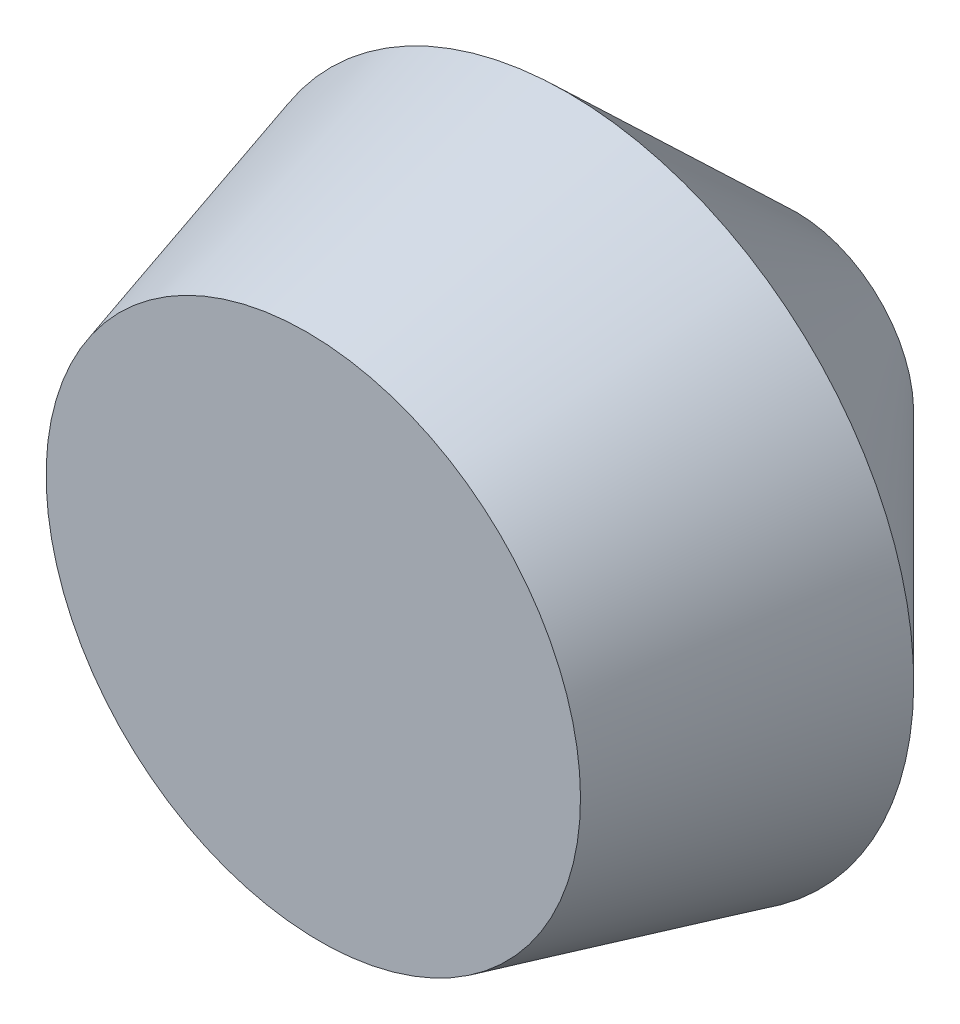
ISO-10303-21;
HEADER;
FILE_DESCRIPTION(('STEP AP214'),'2;1');
FILE_NAME('part.step','',(''),(''),'','','');
FILE_SCHEMA(('AUTOMOTIVE_DESIGN { 1 0 10303 214 1 1 1 1 }'));
ENDSEC;
DATA;
#1=APPLICATION_CONTEXT('core data for automotive mechanical design processes');
#2=APPLICATION_PROTOCOL_DEFINITION('international standard','automotive_design',2000,#1);
#3=PRODUCT_CONTEXT('',#1,'mechanical');
#4=PRODUCT('Part','Part','',(#3));
#5=PRODUCT_RELATED_PRODUCT_CATEGORY('part','',(#4));
#6=PRODUCT_DEFINITION_FORMATION('','',#4);
#7=PRODUCT_DEFINITION_CONTEXT('part definition',#1,'design');
#8=PRODUCT_DEFINITION('design','',#6,#7);
#9=PRODUCT_DEFINITION_SHAPE('','',#8);
#10=(LENGTH_UNIT() NAMED_UNIT(*) SI_UNIT(.MILLI.,.METRE.));
#11=(NAMED_UNIT(*) PLANE_ANGLE_UNIT() SI_UNIT($,.RADIAN.));
#12=(NAMED_UNIT(*) SI_UNIT($,.STERADIAN.) SOLID_ANGLE_UNIT());
#13=UNCERTAINTY_MEASURE_WITH_UNIT(LENGTH_MEASURE(1.E-05),#10,'distance_accuracy_value','');
#14=(GEOMETRIC_REPRESENTATION_CONTEXT(3) GLOBAL_UNCERTAINTY_ASSIGNED_CONTEXT((#13)) GLOBAL_UNIT_ASSIGNED_CONTEXT((#10,
#11,#12)) REPRESENTATION_CONTEXT('',''));
#15=CARTESIAN_POINT('',(0.,0.,0.));
#16=DIRECTION('',(0.,0.,1.));
#17=DIRECTION('',(1.,0.,0.));
#18=AXIS2_PLACEMENT_3D('',#15,#16,#17);
#19=CARTESIAN_POINT('',(-2.3456440540768,62.6400053791689,30.8292296319032));
#20=DIRECTION('',(0.,0.0240493397263667,-0.999710772803177));
#21=DIRECTION('',(0.,0.999710772803177,0.0240493397263667));
#22=AXIS2_PLACEMENT_3D('',#19,#20,#21);
#23=PLANE('',#22);
#24=CARTESIAN_POINT('',(0.0584199999998449,62.4325924386031,30.8242400445075));
#25=DIRECTION('',(0.,-0.0240493397263674,0.999710772803177));
#26=DIRECTION('',(0.,-0.999710772803177,-0.0240493397263674));
#27=AXIS2_PLACEMENT_3D('',#24,#25,#26);
#28=CIRCLE('',#27,2.413);
#29=CARTESIAN_POINT('',(0.0584199999998449,60.020290343829,30.7662089877478));
#30=VERTEX_POINT('',#29);
#31=EDGE_CURVE('E17',#30,#30,#28,.T.);
#32=ORIENTED_EDGE('',*,*,#31,.F.);
#33=EDGE_LOOP('',(#32));
#34=FACE_BOUND('',#33,.T.);
#35=ADVANCED_FACE('F14',(#34),#23,.T.);
#36=CARTESIAN_POINT('',(0.0584199999998508,62.3189737379998,35.5472736195388));
#37=DIRECTION('',(0.,-0.0240493397263674,0.999710772803177));
#38=DIRECTION('',(0.,-0.999710772803177,-0.0240493397263674));
#39=AXIS2_PLACEMENT_3D('',#36,#37,#38);
#40=CONICAL_SURFACE('',#39,7.1374,0.785398163397451);
#41=CARTESIAN_POINT('',(0.0584199999998507,62.3189737379996,35.5472736195492));
#42=DIRECTION('',(0.,0.0240493397263667,-0.999710772803177));
#43=DIRECTION('',(-0.0859813292105588,-0.996008592361908,-0.0239602789724139));
#44=AXIS2_PLACEMENT_3D('',#41,#42,#43);
#45=CIRCLE('',#44,7.13739999997541);
#46=CARTESIAN_POINT('',(-0.555263139105477,55.2100620109002,35.376259524412));
#47=VERTEX_POINT('',#46);
#48=EDGE_CURVE('E21',#47,#47,#45,.F.);
#49=ORIENTED_EDGE('',*,*,#48,.F.);
#50=EDGE_LOOP('',(#49));
#51=FACE_BOUND('',#50,.T.);
#52=ORIENTED_EDGE('',*,*,#31,.T.);
#53=EDGE_LOOP('',(#52));
#54=FACE_BOUND('',#53,.T.);
#55=ADVANCED_FACE('F31',(#51,#54),#40,.T.);
#56=CARTESIAN_POINT('',(0.0584199999998571,62.185807734067,41.0828721107046));
#57=DIRECTION('',(0.,-0.0240493397263667,0.999710772803177));
#58=DIRECTION('',(0.,-0.999710772803177,-0.0240493397263667));
#59=AXIS2_PLACEMENT_3D('',#56,#57,#58);
#60=PLANE('',#59);
#61=CARTESIAN_POINT('',(0.058419999999854,62.1858077340676,41.0828721106782));
#62=DIRECTION('',(0.,0.024049339726367,-0.999710772803177));
#63=DIRECTION('',(0.,0.999710772803177,0.024049339726367));
#64=AXIS2_PLACEMENT_3D('',#61,#62,#63);
#65=CIRCLE('',#64,5.63879999998664);
#66=CARTESIAN_POINT('',(0.058419999999854,67.8229768397368,41.2184815275269));
#67=VERTEX_POINT('',#66);
#68=EDGE_CURVE('E9',#67,#67,#65,.T.);
#69=ORIENTED_EDGE('',*,*,#68,.F.);
#70=EDGE_LOOP('',(#69));
#71=FACE_BOUND('',#70,.T.);
#72=ADVANCED_FACE('F37',(#71),#60,.T.);
#73=CARTESIAN_POINT('',(0.0584199999998507,62.3189737379996,35.5472736195492));
#74=DIRECTION('',(0.,0.024049339726367,-0.999710772803177));
#75=DIRECTION('',(0.,0.999710772803177,0.024049339726367));
#76=AXIS2_PLACEMENT_3D('',#73,#74,#75);
#77=CONICAL_SURFACE('',#76,7.13739999997541,0.264310304018265);
#78=ORIENTED_EDGE('',*,*,#48,.T.);
#79=EDGE_LOOP('',(#78));
#80=FACE_BOUND('',#79,.T.);
#81=ORIENTED_EDGE('',*,*,#68,.T.);
#82=EDGE_LOOP('',(#81));
#83=FACE_BOUND('',#82,.T.);
#84=ADVANCED_FACE('F39',(#80,#83),#77,.T.);
#85=CLOSED_SHELL('',(#35,#55,#72,#84));
#86=MANIFOLD_SOLID_BREP('B1',#85);
#87=ADVANCED_BREP_SHAPE_REPRESENTATION('',(#18,#86),#14);
#88=SHAPE_DEFINITION_REPRESENTATION(#9,#87);
ENDSEC;
END-ISO-10303-21;
